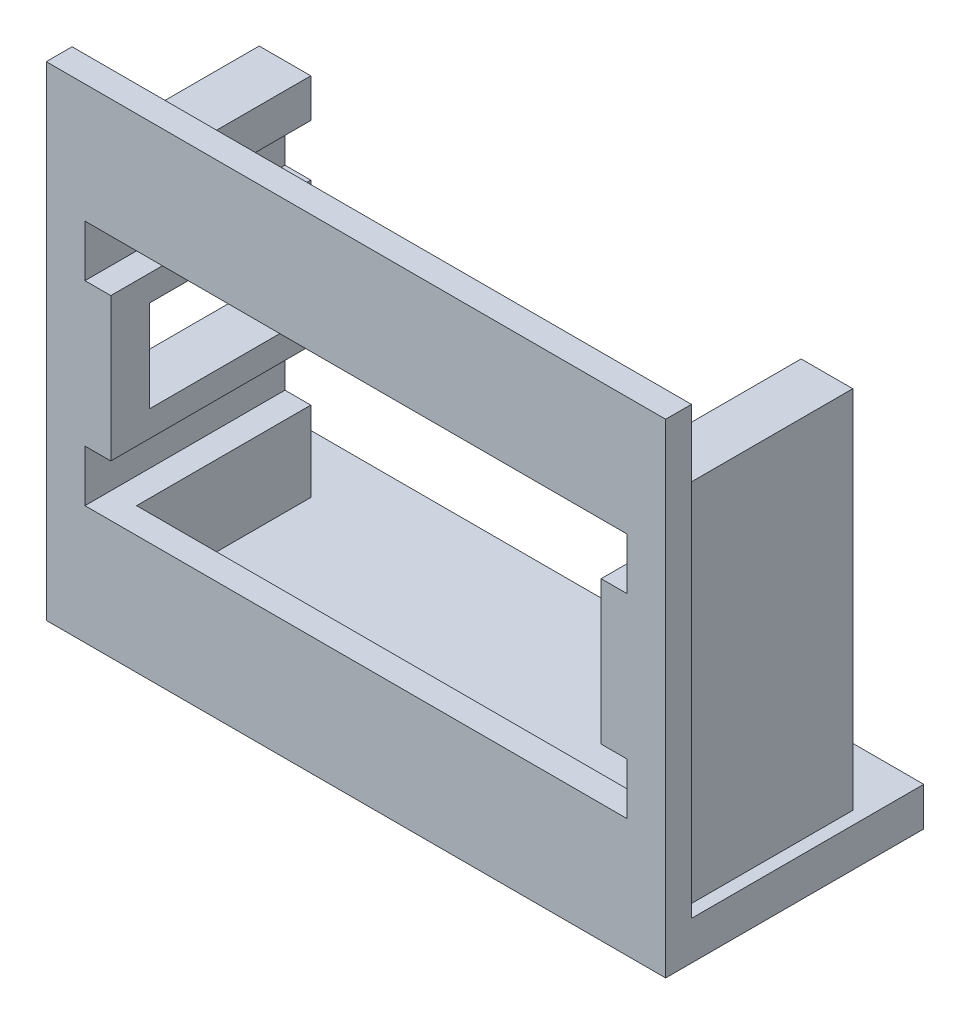
ISO-10303-21;
HEADER;
FILE_DESCRIPTION(('STEP AP214'),'2;1');
FILE_NAME('part.step','',(''),(''),'','','');
FILE_SCHEMA(('AUTOMOTIVE_DESIGN { 1 0 10303 214 1 1 1 1 }'));
ENDSEC;
DATA;
#1=APPLICATION_CONTEXT('core data for automotive mechanical design processes');
#2=APPLICATION_PROTOCOL_DEFINITION('international standard','automotive_design',2000,#1);
#3=PRODUCT_CONTEXT('',#1,'mechanical');
#4=PRODUCT('Part','Part','',(#3));
#5=PRODUCT_RELATED_PRODUCT_CATEGORY('part','',(#4));
#6=PRODUCT_DEFINITION_FORMATION('','',#4);
#7=PRODUCT_DEFINITION_CONTEXT('part definition',#1,'design');
#8=PRODUCT_DEFINITION('design','',#6,#7);
#9=PRODUCT_DEFINITION_SHAPE('','',#8);
#10=(LENGTH_UNIT() NAMED_UNIT(*) SI_UNIT(.MILLI.,.METRE.));
#11=(NAMED_UNIT(*) PLANE_ANGLE_UNIT() SI_UNIT($,.RADIAN.));
#12=(NAMED_UNIT(*) SI_UNIT($,.STERADIAN.) SOLID_ANGLE_UNIT());
#13=UNCERTAINTY_MEASURE_WITH_UNIT(LENGTH_MEASURE(1.E-05),#10,'distance_accuracy_value','');
#14=(GEOMETRIC_REPRESENTATION_CONTEXT(3) GLOBAL_UNCERTAINTY_ASSIGNED_CONTEXT((#13)) GLOBAL_UNIT_ASSIGNED_CONTEXT((#10,
#11,#12)) REPRESENTATION_CONTEXT('',''));
#15=CARTESIAN_POINT('',(0.,0.,0.));
#16=DIRECTION('',(0.,0.,1.));
#17=DIRECTION('',(1.,0.,0.));
#18=AXIS2_PLACEMENT_3D('',#15,#16,#17);
#19=CARTESIAN_POINT('',(36.,11.99,55.));
#20=DIRECTION('',(0.,0.,-1.));
#21=DIRECTION('',(-1.,0.,0.));
#22=AXIS2_PLACEMENT_3D('',#19,#20,#21);
#23=PLANE('',#22);
#24=DIRECTION('',(1.,0.,0.));
#25=VECTOR('',#24,1.);
#26=CARTESIAN_POINT('',(36.,12.,55.));
#27=LINE('',#26,#25);
#28=CARTESIAN_POINT('',(36.,12.,55.));
#29=VERTEX_POINT('',#28);
#30=CARTESIAN_POINT('',(84.,12.,55.));
#31=VERTEX_POINT('',#30);
#32=EDGE_CURVE('E610',#29,#31,#27,.T.);
#33=ORIENTED_EDGE('',*,*,#32,.F.);
#34=DIRECTION('',(0.,-1.,0.));
#35=VECTOR('',#34,1.);
#36=CARTESIAN_POINT('',(36.,49.5,55.));
#37=LINE('',#36,#35);
#38=CARTESIAN_POINT('',(36.,15.,55.));
#39=VERTEX_POINT('',#38);
#40=EDGE_CURVE('E628',#39,#29,#37,.T.);
#41=ORIENTED_EDGE('',*,*,#40,.F.);
#42=DIRECTION('',(-1.,0.,0.));
#43=VECTOR('',#42,1.);
#44=CARTESIAN_POINT('',(0.,15.,55.));
#45=LINE('',#44,#43);
#46=CARTESIAN_POINT('',(84.,15.,55.));
#47=VERTEX_POINT('',#46);
#48=EDGE_CURVE('E620',#47,#39,#45,.T.);
#49=ORIENTED_EDGE('',*,*,#48,.F.);
#50=DIRECTION('',(0.,1.,0.));
#51=VECTOR('',#50,1.);
#52=CARTESIAN_POINT('',(84.,49.5,55.));
#53=LINE('',#52,#51);
#54=EDGE_CURVE('E621',#31,#47,#53,.T.);
#55=ORIENTED_EDGE('',*,*,#54,.F.);
#56=EDGE_LOOP('',(#33,#41,#49,#55));
#57=FACE_BOUND('',#56,.T.);
#58=ADVANCED_FACE('F385',(#57),#23,.T.);
#59=CARTESIAN_POINT('',(84.,49.5,-75.01));
#60=DIRECTION('',(1.,0.,0.));
#61=DIRECTION('',(0.,0.,-1.));
#62=AXIS2_PLACEMENT_3D('',#59,#60,#61);
#63=PLANE('',#62);
#64=DIRECTION('',(0.,0.,1.));
#65=VECTOR('',#64,1.);
#66=CARTESIAN_POINT('',(84.,12.,-75.01));
#67=LINE('',#66,#65);
#68=CARTESIAN_POINT('',(84.,12.,75.));
#69=VERTEX_POINT('',#68);
#70=EDGE_CURVE('E613',#31,#69,#67,.T.);
#71=ORIENTED_EDGE('',*,*,#70,.F.);
#72=ORIENTED_EDGE('',*,*,#54,.T.);
#73=DIRECTION('',(0.,0.,-1.));
#74=VECTOR('',#73,1.);
#75=CARTESIAN_POINT('',(84.,15.,0.));
#76=LINE('',#75,#74);
#77=CARTESIAN_POINT('',(84.,15.,73.));
#78=VERTEX_POINT('',#77);
#79=EDGE_CURVE('E389',#78,#47,#76,.T.);
#80=ORIENTED_EDGE('',*,*,#79,.F.);
#81=DIRECTION('',(0.,-1.,0.));
#82=VECTOR('',#81,1.);
#83=CARTESIAN_POINT('',(84.,80.,73.));
#84=LINE('',#83,#82);
#85=CARTESIAN_POINT('',(84.,49.5,73.));
#86=VERTEX_POINT('',#85);
#87=EDGE_CURVE('E646',#86,#78,#84,.T.);
#88=ORIENTED_EDGE('',*,*,#87,.F.);
#89=DIRECTION('',(0.,0.,1.));
#90=VECTOR('',#89,1.);
#91=CARTESIAN_POINT('',(84.,49.5,-75.01));
#92=LINE('',#91,#90);
#93=CARTESIAN_POINT('',(84.,49.5,75.));
#94=VERTEX_POINT('',#93);
#95=EDGE_CURVE('E403',#86,#94,#92,.T.);
#96=ORIENTED_EDGE('',*,*,#95,.T.);
#97=DIRECTION('',(0.,-1.,0.));
#98=VECTOR('',#97,1.);
#99=CARTESIAN_POINT('',(84.,80.,75.));
#100=LINE('',#99,#98);
#101=EDGE_CURVE('E633',#94,#69,#100,.T.);
#102=ORIENTED_EDGE('',*,*,#101,.T.);
#103=EDGE_LOOP('',(#71,#72,#80,#88,#96,#102));
#104=FACE_BOUND('',#103,.T.);
#105=ADVANCED_FACE('F631',(#104),#63,.T.);
#106=CARTESIAN_POINT('',(53.6751725826515,34.3,72.));
#107=DIRECTION('',(0.,1.,0.));
#108=DIRECTION('',(-1.,0.,0.));
#109=AXIS2_PLACEMENT_3D('',#106,#107,#108);
#110=PLANE('',#109);
#111=DIRECTION('',(0.,0.,1.));
#112=VECTOR('',#111,1.);
#113=CARTESIAN_POINT('',(41.,34.3,72.));
#114=LINE('',#113,#112);
#115=CARTESIAN_POINT('',(41.,34.3,61.5));
#116=VERTEX_POINT('',#115);
#117=CARTESIAN_POINT('',(41.,34.3,72.));
#118=VERTEX_POINT('',#117);
#119=EDGE_CURVE('E665',#116,#118,#114,.T.);
#120=ORIENTED_EDGE('',*,*,#119,.T.);
#121=DIRECTION('',(-1.,0.,0.));
#122=VECTOR('',#121,1.);
#123=CARTESIAN_POINT('',(53.6751725826515,34.3,72.));
#124=LINE('',#123,#122);
#125=CARTESIAN_POINT('',(37.,34.3,72.));
#126=VERTEX_POINT('',#125);
#127=EDGE_CURVE('E697',#118,#126,#124,.T.);
#128=ORIENTED_EDGE('',*,*,#127,.T.);
#129=DIRECTION('',(0.,0.,-1.));
#130=VECTOR('',#129,1.);
#131=CARTESIAN_POINT('',(37.,34.3,72.));
#132=LINE('',#131,#130);
#133=CARTESIAN_POINT('',(37.,34.3,61.5));
#134=VERTEX_POINT('',#133);
#135=EDGE_CURVE('E683',#126,#134,#132,.T.);
#136=ORIENTED_EDGE('',*,*,#135,.T.);
#137=DIRECTION('',(-1.,0.,0.));
#138=VECTOR('',#137,1.);
#139=CARTESIAN_POINT('',(53.6751725826515,34.3,61.5));
#140=LINE('',#139,#138);
#141=EDGE_CURVE('E694',#116,#134,#140,.T.);
#142=ORIENTED_EDGE('',*,*,#141,.F.);
#143=EDGE_LOOP('',(#120,#128,#136,#142));
#144=FACE_BOUND('',#143,.T.);
#145=ADVANCED_FACE('F1068',(#144),#110,.F.);
#146=CARTESIAN_POINT('',(53.6751725826515,27.2,72.));
#147=DIRECTION('',(0.,0.,1.));
#148=DIRECTION('',(1.,0.,0.));
#149=AXIS2_PLACEMENT_3D('',#146,#147,#148);
#150=PLANE('',#149);
#151=DIRECTION('',(0.,-1.,0.));
#152=VECTOR('',#151,1.);
#153=CARTESIAN_POINT('',(41.,27.2,72.));
#154=LINE('',#153,#152);
#155=CARTESIAN_POINT('',(41.,27.2,72.));
#156=VERTEX_POINT('',#155);
#157=EDGE_CURVE('E676',#118,#156,#154,.T.);
#158=ORIENTED_EDGE('',*,*,#157,.T.);
#159=DIRECTION('',(-1.,0.,0.));
#160=VECTOR('',#159,1.);
#161=CARTESIAN_POINT('',(53.6751725826515,27.2,72.));
#162=LINE('',#161,#160);
#163=CARTESIAN_POINT('',(37.,27.2,72.));
#164=VERTEX_POINT('',#163);
#165=EDGE_CURVE('E691',#156,#164,#162,.T.);
#166=ORIENTED_EDGE('',*,*,#165,.T.);
#167=DIRECTION('',(0.,1.,0.));
#168=VECTOR('',#167,1.);
#169=CARTESIAN_POINT('',(37.,27.2,72.));
#170=LINE('',#169,#168);
#171=EDGE_CURVE('E679',#164,#126,#170,.T.);
#172=ORIENTED_EDGE('',*,*,#171,.T.);
#173=ORIENTED_EDGE('',*,*,#127,.F.);
#174=EDGE_LOOP('',(#158,#166,#172,#173));
#175=FACE_BOUND('',#174,.T.);
#176=ADVANCED_FACE('F1070',(#175),#150,.F.);
#177=CARTESIAN_POINT('',(53.6751725826515,27.2,61.5));
#178=DIRECTION('',(0.,-1.,0.));
#179=DIRECTION('',(1.,0.,0.));
#180=AXIS2_PLACEMENT_3D('',#177,#178,#179);
#181=PLANE('',#180);
#182=DIRECTION('',(0.,0.,-1.));
#183=VECTOR('',#182,1.);
#184=CARTESIAN_POINT('',(41.,27.2,61.5));
#185=LINE('',#184,#183);
#186=CARTESIAN_POINT('',(41.,27.2,61.5));
#187=VERTEX_POINT('',#186);
#188=EDGE_CURVE('E673',#156,#187,#185,.T.);
#189=ORIENTED_EDGE('',*,*,#188,.T.);
#190=DIRECTION('',(-1.,0.,0.));
#191=VECTOR('',#190,1.);
#192=CARTESIAN_POINT('',(53.6751725826515,27.2,61.5));
#193=LINE('',#192,#191);
#194=CARTESIAN_POINT('',(37.,27.2,61.5));
#195=VERTEX_POINT('',#194);
#196=EDGE_CURVE('E670',#187,#195,#193,.T.);
#197=ORIENTED_EDGE('',*,*,#196,.T.);
#198=DIRECTION('',(0.,0.,1.));
#199=VECTOR('',#198,1.);
#200=CARTESIAN_POINT('',(37.,27.2,61.5));
#201=LINE('',#200,#199);
#202=EDGE_CURVE('E643',#195,#164,#201,.T.);
#203=ORIENTED_EDGE('',*,*,#202,.T.);
#204=ORIENTED_EDGE('',*,*,#165,.F.);
#205=EDGE_LOOP('',(#189,#197,#203,#204));
#206=FACE_BOUND('',#205,.T.);
#207=ADVANCED_FACE('F1077',(#206),#181,.F.);
#208=CARTESIAN_POINT('',(53.6751725826515,34.3,61.5));
#209=DIRECTION('',(0.,0.,-1.));
#210=DIRECTION('',(-1.,0.,0.));
#211=AXIS2_PLACEMENT_3D('',#208,#209,#210);
#212=PLANE('',#211);
#213=DIRECTION('',(0.,1.,0.));
#214=VECTOR('',#213,1.);
#215=CARTESIAN_POINT('',(41.,34.3,61.5));
#216=LINE('',#215,#214);
#217=EDGE_CURVE('E669',#187,#116,#216,.T.);
#218=ORIENTED_EDGE('',*,*,#217,.T.);
#219=ORIENTED_EDGE('',*,*,#141,.T.);
#220=DIRECTION('',(0.,-1.,0.));
#221=VECTOR('',#220,1.);
#222=CARTESIAN_POINT('',(37.,34.3,61.5));
#223=LINE('',#222,#221);
#224=EDGE_CURVE('E687',#134,#195,#223,.T.);
#225=ORIENTED_EDGE('',*,*,#224,.T.);
#226=ORIENTED_EDGE('',*,*,#196,.F.);
#227=EDGE_LOOP('',(#218,#219,#225,#226));
#228=FACE_BOUND('',#227,.T.);
#229=ADVANCED_FACE('F1083',(#228),#212,.F.);
#230=CARTESIAN_POINT('',(39.,36.3,30.4698930168287));
#231=DIRECTION('',(0.,-1.,0.));
#232=DIRECTION('',(0.,0.,-1.));
#233=AXIS2_PLACEMENT_3D('',#230,#231,#232);
#234=PLANE('',#233);
#235=DIRECTION('',(0.,0.,1.));
#236=VECTOR('',#235,1.);
#237=CARTESIAN_POINT('',(39.,36.3,30.4698930168287));
#238=LINE('',#237,#236);
#239=CARTESIAN_POINT('',(39.,36.3,59.5));
#240=VERTEX_POINT('',#239);
#241=CARTESIAN_POINT('',(39.,36.3,75.));
#242=VERTEX_POINT('',#241);
#243=EDGE_CURVE('E902',#240,#242,#238,.T.);
#244=ORIENTED_EDGE('',*,*,#243,.T.);
#245=DIRECTION('',(1.,0.,0.));
#246=VECTOR('',#245,1.);
#247=CARTESIAN_POINT('',(39.,36.3,75.));
#248=LINE('',#247,#246);
#249=CARTESIAN_POINT('',(41.,36.3,75.));
#250=VERTEX_POINT('',#249);
#251=EDGE_CURVE('E898',#242,#250,#248,.T.);
#252=ORIENTED_EDGE('',*,*,#251,.T.);
#253=DIRECTION('',(0.,0.,1.));
#254=VECTOR('',#253,1.);
#255=CARTESIAN_POINT('',(41.,36.3,30.4698930168287));
#256=LINE('',#255,#254);
#257=CARTESIAN_POINT('',(41.,36.3,59.5));
#258=VERTEX_POINT('',#257);
#259=EDGE_CURVE('E908',#258,#250,#256,.T.);
#260=ORIENTED_EDGE('',*,*,#259,.F.);
#261=DIRECTION('',(1.,0.,0.));
#262=VECTOR('',#261,1.);
#263=CARTESIAN_POINT('',(41.,36.3,59.5));
#264=LINE('',#263,#262);
#265=EDGE_CURVE('E859',#240,#258,#264,.T.);
#266=ORIENTED_EDGE('',*,*,#265,.F.);
#267=EDGE_LOOP('',(#244,#252,#260,#266));
#268=FACE_BOUND('',#267,.T.);
#269=ADVANCED_FACE('F1118',(#268),#234,.F.);
#270=CARTESIAN_POINT('',(39.,40.3,30.4698930168287));
#271=DIRECTION('',(-1.,0.,0.));
#272=DIRECTION('',(0.,0.,1.));
#273=AXIS2_PLACEMENT_3D('',#270,#271,#272);
#274=PLANE('',#273);
#275=DIRECTION('',(0.,0.,1.));
#276=VECTOR('',#275,1.);
#277=CARTESIAN_POINT('',(39.,40.3,30.4698930168287));
#278=LINE('',#277,#276);
#279=CARTESIAN_POINT('',(39.,40.3,59.5));
#280=VERTEX_POINT('',#279);
#281=CARTESIAN_POINT('',(39.,40.3,75.));
#282=VERTEX_POINT('',#281);
#283=EDGE_CURVE('E897',#280,#282,#278,.T.);
#284=ORIENTED_EDGE('',*,*,#283,.T.);
#285=DIRECTION('',(0.,-1.,0.));
#286=VECTOR('',#285,1.);
#287=CARTESIAN_POINT('',(39.,40.3,75.));
#288=LINE('',#287,#286);
#289=EDGE_CURVE('E903',#282,#242,#288,.T.);
#290=ORIENTED_EDGE('',*,*,#289,.T.);
#291=ORIENTED_EDGE('',*,*,#243,.F.);
#292=DIRECTION('',(0.,-1.,0.));
#293=VECTOR('',#292,1.);
#294=CARTESIAN_POINT('',(39.,36.3,59.5));
#295=LINE('',#294,#293);
#296=EDGE_CURVE('E863',#280,#240,#295,.T.);
#297=ORIENTED_EDGE('',*,*,#296,.F.);
#298=EDGE_LOOP('',(#284,#290,#291,#297));
#299=FACE_BOUND('',#298,.T.);
#300=ADVANCED_FACE('F1010',(#299),#274,.F.);
#301=CARTESIAN_POINT('',(81.,40.3,30.4698930168287));
#302=DIRECTION('',(-1.,0.,0.));
#303=DIRECTION('',(0.,0.,1.));
#304=AXIS2_PLACEMENT_3D('',#301,#302,#303);
#305=PLANE('',#304);
#306=DIRECTION('',(0.,0.,1.));
#307=VECTOR('',#306,1.);
#308=CARTESIAN_POINT('',(81.,40.3,30.4698930168287));
#309=LINE('',#308,#307);
#310=CARTESIAN_POINT('',(81.,40.3,59.5));
#311=VERTEX_POINT('',#310);
#312=CARTESIAN_POINT('',(81.,40.3,75.));
#313=VERTEX_POINT('',#312);
#314=EDGE_CURVE('E956',#311,#313,#309,.T.);
#315=ORIENTED_EDGE('',*,*,#314,.F.);
#316=DIRECTION('',(0.,1.,0.));
#317=VECTOR('',#316,1.);
#318=CARTESIAN_POINT('',(81.,40.3,59.5));
#319=LINE('',#318,#317);
#320=CARTESIAN_POINT('',(81.,36.3,59.5));
#321=VERTEX_POINT('',#320);
#322=EDGE_CURVE('E745',#321,#311,#319,.T.);
#323=ORIENTED_EDGE('',*,*,#322,.F.);
#324=DIRECTION('',(0.,0.,1.));
#325=VECTOR('',#324,1.);
#326=CARTESIAN_POINT('',(81.,36.3,30.4698930168287));
#327=LINE('',#326,#325);
#328=CARTESIAN_POINT('',(81.,36.3,75.));
#329=VERTEX_POINT('',#328);
#330=EDGE_CURVE('E791',#321,#329,#327,.T.);
#331=ORIENTED_EDGE('',*,*,#330,.T.);
#332=DIRECTION('',(0.,-1.,0.));
#333=VECTOR('',#332,1.);
#334=CARTESIAN_POINT('',(81.,40.3,75.));
#335=LINE('',#334,#333);
#336=EDGE_CURVE('E941',#313,#329,#335,.T.);
#337=ORIENTED_EDGE('',*,*,#336,.F.);
#338=EDGE_LOOP('',(#315,#323,#331,#337));
#339=FACE_BOUND('',#338,.T.);
#340=ADVANCED_FACE('F1001',(#339),#305,.T.);
#341=CARTESIAN_POINT('',(81.,36.3,30.4698930168287));
#342=DIRECTION('',(0.,1.,0.));
#343=DIRECTION('',(0.,0.,1.));
#344=AXIS2_PLACEMENT_3D('',#341,#342,#343);
#345=PLANE('',#344);
#346=ORIENTED_EDGE('',*,*,#330,.F.);
#347=DIRECTION('',(1.,0.,0.));
#348=VECTOR('',#347,1.);
#349=CARTESIAN_POINT('',(81.,36.3,59.5));
#350=LINE('',#349,#348);
#351=CARTESIAN_POINT('',(79.,36.3,59.5));
#352=VERTEX_POINT('',#351);
#353=EDGE_CURVE('E741',#352,#321,#350,.T.);
#354=ORIENTED_EDGE('',*,*,#353,.F.);
#355=DIRECTION('',(0.,0.,1.));
#356=VECTOR('',#355,1.);
#357=CARTESIAN_POINT('',(79.,36.3,30.4698930168287));
#358=LINE('',#357,#356);
#359=CARTESIAN_POINT('',(79.,36.3,75.));
#360=VERTEX_POINT('',#359);
#361=EDGE_CURVE('E911',#352,#360,#358,.T.);
#362=ORIENTED_EDGE('',*,*,#361,.T.);
#363=DIRECTION('',(-1.,0.,0.));
#364=VECTOR('',#363,1.);
#365=CARTESIAN_POINT('',(81.,36.3,75.));
#366=LINE('',#365,#364);
#367=EDGE_CURVE('E952',#329,#360,#366,.T.);
#368=ORIENTED_EDGE('',*,*,#367,.F.);
#369=EDGE_LOOP('',(#346,#354,#362,#368));
#370=FACE_BOUND('',#369,.T.);
#371=ADVANCED_FACE('F1058',(#370),#345,.T.);
#372=CARTESIAN_POINT('',(79.,40.3,30.4698930168287));
#373=DIRECTION('',(-1.,0.,0.));
#374=DIRECTION('',(0.,0.,1.));
#375=AXIS2_PLACEMENT_3D('',#372,#373,#374);
#376=PLANE('',#375);
#377=DIRECTION('',(0.,0.,1.));
#378=VECTOR('',#377,1.);
#379=CARTESIAN_POINT('',(79.,25.2,30.4698930168287));
#380=LINE('',#379,#378);
#381=CARTESIAN_POINT('',(79.,25.2,59.5));
#382=VERTEX_POINT('',#381);
#383=CARTESIAN_POINT('',(79.,25.2,75.));
#384=VERTEX_POINT('',#383);
#385=EDGE_CURVE('E942',#382,#384,#380,.T.);
#386=ORIENTED_EDGE('',*,*,#385,.T.);
#387=DIRECTION('',(0.,-1.,0.));
#388=VECTOR('',#387,1.);
#389=CARTESIAN_POINT('',(79.,40.3,75.));
#390=LINE('',#389,#388);
#391=EDGE_CURVE('E879',#360,#384,#390,.T.);
#392=ORIENTED_EDGE('',*,*,#391,.F.);
#393=ORIENTED_EDGE('',*,*,#361,.F.);
#394=DIRECTION('',(0.,1.,0.));
#395=VECTOR('',#394,1.);
#396=CARTESIAN_POINT('',(79.,36.3,59.5));
#397=LINE('',#396,#395);
#398=EDGE_CURVE('E737',#382,#352,#397,.T.);
#399=ORIENTED_EDGE('',*,*,#398,.F.);
#400=EDGE_LOOP('',(#386,#392,#393,#399));
#401=FACE_BOUND('',#400,.T.);
#402=ADVANCED_FACE('F1054',(#401),#376,.T.);
#403=CARTESIAN_POINT('',(81.,25.2,30.4698930168287));
#404=DIRECTION('',(0.,1.,0.));
#405=DIRECTION('',(0.,0.,1.));
#406=AXIS2_PLACEMENT_3D('',#403,#404,#405);
#407=PLANE('',#406);
#408=DIRECTION('',(0.,0.,1.));
#409=VECTOR('',#408,1.);
#410=CARTESIAN_POINT('',(81.,25.2,30.4698930168287));
#411=LINE('',#410,#409);
#412=CARTESIAN_POINT('',(81.,25.2,59.5));
#413=VERTEX_POINT('',#412);
#414=CARTESIAN_POINT('',(81.,25.2,75.));
#415=VERTEX_POINT('',#414);
#416=EDGE_CURVE('E937',#413,#415,#411,.T.);
#417=ORIENTED_EDGE('',*,*,#416,.T.);
#418=DIRECTION('',(-1.,0.,0.));
#419=VECTOR('',#418,1.);
#420=CARTESIAN_POINT('',(81.,25.2,75.));
#421=LINE('',#420,#419);
#422=EDGE_CURVE('E933',#415,#384,#421,.T.);
#423=ORIENTED_EDGE('',*,*,#422,.T.);
#424=ORIENTED_EDGE('',*,*,#385,.F.);
#425=DIRECTION('',(-1.,0.,0.));
#426=VECTOR('',#425,1.);
#427=CARTESIAN_POINT('',(79.,25.2,59.5));
#428=LINE('',#427,#426);
#429=EDGE_CURVE('E733',#413,#382,#428,.T.);
#430=ORIENTED_EDGE('',*,*,#429,.F.);
#431=EDGE_LOOP('',(#417,#423,#424,#430));
#432=FACE_BOUND('',#431,.T.);
#433=ADVANCED_FACE('F1050',(#432),#407,.F.);
#434=CARTESIAN_POINT('',(81.,21.2,30.4698930168287));
#435=DIRECTION('',(1.,0.,0.));
#436=DIRECTION('',(0.,0.,-1.));
#437=AXIS2_PLACEMENT_3D('',#434,#435,#436);
#438=PLANE('',#437);
#439=DIRECTION('',(0.,0.,1.));
#440=VECTOR('',#439,1.);
#441=CARTESIAN_POINT('',(81.,21.2,30.4698930168287));
#442=LINE('',#441,#440);
#443=CARTESIAN_POINT('',(81.,21.2,59.5));
#444=VERTEX_POINT('',#443);
#445=CARTESIAN_POINT('',(81.,21.2,75.));
#446=VERTEX_POINT('',#445);
#447=EDGE_CURVE('E930',#444,#446,#442,.T.);
#448=ORIENTED_EDGE('',*,*,#447,.T.);
#449=DIRECTION('',(0.,1.,0.));
#450=VECTOR('',#449,1.);
#451=CARTESIAN_POINT('',(81.,21.2,75.));
#452=LINE('',#451,#450);
#453=EDGE_CURVE('E938',#446,#415,#452,.T.);
#454=ORIENTED_EDGE('',*,*,#453,.T.);
#455=ORIENTED_EDGE('',*,*,#416,.F.);
#456=DIRECTION('',(0.,1.,0.));
#457=VECTOR('',#456,1.);
#458=CARTESIAN_POINT('',(81.,25.2,59.5));
#459=LINE('',#458,#457);
#460=EDGE_CURVE('E729',#444,#413,#459,.T.);
#461=ORIENTED_EDGE('',*,*,#460,.F.);
#462=EDGE_LOOP('',(#448,#454,#455,#461));
#463=FACE_BOUND('',#462,.T.);
#464=ADVANCED_FACE('F1046',(#463),#438,.F.);
#465=CARTESIAN_POINT('',(41.,21.2,30.4698930168287));
#466=DIRECTION('',(0.,-1.,0.));
#467=DIRECTION('',(1.,0.,0.));
#468=AXIS2_PLACEMENT_3D('',#465,#466,#467);
#469=PLANE('',#468);
#470=DIRECTION('',(1.,0.,0.));
#471=VECTOR('',#470,1.);
#472=CARTESIAN_POINT('',(41.,21.2,75.));
#473=LINE('',#472,#471);
#474=CARTESIAN_POINT('',(39.,21.2,75.));
#475=VERTEX_POINT('',#474);
#476=EDGE_CURVE('E884',#475,#446,#473,.T.);
#477=ORIENTED_EDGE('',*,*,#476,.T.);
#478=ORIENTED_EDGE('',*,*,#447,.F.);
#479=DIRECTION('',(1.,0.,0.));
#480=VECTOR('',#479,1.);
#481=CARTESIAN_POINT('',(81.,21.2,59.5));
#482=LINE('',#481,#480);
#483=CARTESIAN_POINT('',(79.,21.2,59.5));
#484=VERTEX_POINT('',#483);
#485=EDGE_CURVE('E725',#484,#444,#482,.T.);
#486=ORIENTED_EDGE('',*,*,#485,.F.);
#487=DIRECTION('',(0.,0.,1.));
#488=VECTOR('',#487,1.);
#489=CARTESIAN_POINT('',(79.,21.2,59.5));
#490=LINE('',#489,#488);
#491=CARTESIAN_POINT('',(79.,21.2,73.));
#492=VERTEX_POINT('',#491);
#493=EDGE_CURVE('E772',#484,#492,#490,.T.);
#494=ORIENTED_EDGE('',*,*,#493,.T.);
#495=DIRECTION('',(1.,0.,0.));
#496=VECTOR('',#495,1.);
#497=CARTESIAN_POINT('',(41.,21.2,73.));
#498=LINE('',#497,#496);
#499=CARTESIAN_POINT('',(41.,21.2,73.));
#500=VERTEX_POINT('',#499);
#501=EDGE_CURVE('E883',#500,#492,#498,.T.);
#502=ORIENTED_EDGE('',*,*,#501,.F.);
#503=DIRECTION('',(0.,0.,1.));
#504=VECTOR('',#503,1.);
#505=CARTESIAN_POINT('',(41.,21.2,59.5));
#506=LINE('',#505,#504);
#507=CARTESIAN_POINT('',(41.,21.2,59.5));
#508=VERTEX_POINT('',#507);
#509=EDGE_CURVE('E795',#508,#500,#506,.T.);
#510=ORIENTED_EDGE('',*,*,#509,.F.);
#511=DIRECTION('',(1.,0.,0.));
#512=VECTOR('',#511,1.);
#513=CARTESIAN_POINT('',(41.,21.2,59.5));
#514=LINE('',#513,#512);
#515=CARTESIAN_POINT('',(39.,21.2,59.5));
#516=VERTEX_POINT('',#515);
#517=EDGE_CURVE('E844',#516,#508,#514,.T.);
#518=ORIENTED_EDGE('',*,*,#517,.F.);
#519=DIRECTION('',(0.,0.,1.));
#520=VECTOR('',#519,1.);
#521=CARTESIAN_POINT('',(39.,21.2,30.4698930168287));
#522=LINE('',#521,#520);
#523=EDGE_CURVE('E921',#516,#475,#522,.T.);
#524=ORIENTED_EDGE('',*,*,#523,.T.);
#525=EDGE_LOOP('',(#477,#478,#486,#494,#502,#510,#518,#524));
#526=FACE_BOUND('',#525,.T.);
#527=ADVANCED_FACE('F1042',(#526),#469,.F.);
#528=CARTESIAN_POINT('',(41.,40.3,30.4698930168287));
#529=DIRECTION('',(-1.,0.,0.));
#530=DIRECTION('',(0.,0.,1.));
#531=AXIS2_PLACEMENT_3D('',#528,#529,#530);
#532=PLANE('',#531);
#533=ORIENTED_EDGE('',*,*,#217,.F.);
#534=ORIENTED_EDGE('',*,*,#188,.F.);
#535=ORIENTED_EDGE('',*,*,#157,.F.);
#536=ORIENTED_EDGE('',*,*,#119,.F.);
#537=EDGE_LOOP('',(#533,#534,#535,#536));
#538=FACE_BOUND('',#537,.T.);
#539=ORIENTED_EDGE('',*,*,#259,.T.);
#540=DIRECTION('',(0.,-1.,0.));
#541=VECTOR('',#540,1.);
#542=CARTESIAN_POINT('',(41.,40.3,75.));
#543=LINE('',#542,#541);
#544=CARTESIAN_POINT('',(41.,25.2,75.));
#545=VERTEX_POINT('',#544);
#546=EDGE_CURVE('E887',#250,#545,#543,.T.);
#547=ORIENTED_EDGE('',*,*,#546,.T.);
#548=DIRECTION('',(0.,0.,1.));
#549=VECTOR('',#548,1.);
#550=CARTESIAN_POINT('',(41.,25.2,30.4698930168287));
#551=LINE('',#550,#549);
#552=CARTESIAN_POINT('',(41.,25.2,59.5));
#553=VERTEX_POINT('',#552);
#554=EDGE_CURVE('E878',#553,#545,#551,.T.);
#555=ORIENTED_EDGE('',*,*,#554,.F.);
#556=DIRECTION('',(0.,-1.,0.));
#557=VECTOR('',#556,1.);
#558=CARTESIAN_POINT('',(41.,36.3,59.5));
#559=LINE('',#558,#557);
#560=EDGE_CURVE('E855',#258,#553,#559,.T.);
#561=ORIENTED_EDGE('',*,*,#560,.F.);
#562=EDGE_LOOP('',(#539,#547,#555,#561));
#563=FACE_BOUND('',#562,.T.);
#564=ADVANCED_FACE('F1091',(#538,#563),#532,.F.);
#565=CARTESIAN_POINT('',(0.,0.,59.5));
#566=DIRECTION('',(0.,0.,1.));
#567=DIRECTION('',(1.,0.,0.));
#568=AXIS2_PLACEMENT_3D('',#565,#566,#567);
#569=PLANE('',#568);
#570=DIRECTION('',(0.,1.,0.));
#571=VECTOR('',#570,1.);
#572=CARTESIAN_POINT('',(79.,43.3,59.5));
#573=LINE('',#572,#571);
#574=CARTESIAN_POINT('',(79.,40.3,59.5));
#575=VERTEX_POINT('',#574);
#576=CARTESIAN_POINT('',(79.,43.3,59.5));
#577=VERTEX_POINT('',#576);
#578=EDGE_CURVE('E706',#575,#577,#573,.T.);
#579=ORIENTED_EDGE('',*,*,#578,.T.);
#580=DIRECTION('',(1.,0.,0.));
#581=VECTOR('',#580,1.);
#582=CARTESIAN_POINT('',(79.,43.3,59.5));
#583=LINE('',#582,#581);
#584=CARTESIAN_POINT('',(83.,43.3,59.5));
#585=VERTEX_POINT('',#584);
#586=EDGE_CURVE('E710',#577,#585,#583,.T.);
#587=ORIENTED_EDGE('',*,*,#586,.T.);
#588=DIRECTION('',(0.,-1.,0.));
#589=VECTOR('',#588,1.);
#590=CARTESIAN_POINT('',(83.,43.3,59.5));
#591=LINE('',#590,#589);
#592=CARTESIAN_POINT('',(83.,15.,59.5));
#593=VERTEX_POINT('',#592);
#594=EDGE_CURVE('E714',#585,#593,#591,.T.);
#595=ORIENTED_EDGE('',*,*,#594,.T.);
#596=DIRECTION('',(-1.,0.,0.));
#597=VECTOR('',#596,1.);
#598=CARTESIAN_POINT('',(79.,15.,59.5));
#599=LINE('',#598,#597);
#600=CARTESIAN_POINT('',(79.,15.,59.5));
#601=VERTEX_POINT('',#600);
#602=EDGE_CURVE('E718',#593,#601,#599,.T.);
#603=ORIENTED_EDGE('',*,*,#602,.T.);
#604=DIRECTION('',(0.,1.,0.));
#605=VECTOR('',#604,1.);
#606=CARTESIAN_POINT('',(79.,21.2,59.5));
#607=LINE('',#606,#605);
#608=EDGE_CURVE('E722',#601,#484,#607,.T.);
#609=ORIENTED_EDGE('',*,*,#608,.T.);
#610=ORIENTED_EDGE('',*,*,#485,.T.);
#611=ORIENTED_EDGE('',*,*,#460,.T.);
#612=ORIENTED_EDGE('',*,*,#429,.T.);
#613=ORIENTED_EDGE('',*,*,#398,.T.);
#614=ORIENTED_EDGE('',*,*,#353,.T.);
#615=ORIENTED_EDGE('',*,*,#322,.T.);
#616=DIRECTION('',(-1.,0.,0.));
#617=VECTOR('',#616,1.);
#618=CARTESIAN_POINT('',(79.,40.3,59.5));
#619=LINE('',#618,#617);
#620=EDGE_CURVE('E749',#311,#575,#619,.T.);
#621=ORIENTED_EDGE('',*,*,#620,.T.);
#622=EDGE_LOOP('',(#579,#587,#595,#603,#609,#610,#611,#612,#613,#614,#615,#621));
#623=FACE_BOUND('',#622,.T.);
#624=ADVANCED_FACE('F997',(#623),#569,.F.);
#625=CARTESIAN_POINT('',(79.,21.2,59.5));
#626=DIRECTION('',(1.,0.,0.));
#627=DIRECTION('',(0.,1.,0.));
#628=AXIS2_PLACEMENT_3D('',#625,#626,#627);
#629=PLANE('',#628);
#630=DIRECTION('',(0.,1.,0.));
#631=VECTOR('',#630,1.);
#632=CARTESIAN_POINT('',(79.,21.2,73.));
#633=LINE('',#632,#631);
#634=CARTESIAN_POINT('',(79.,15.,73.));
#635=VERTEX_POINT('',#634);
#636=EDGE_CURVE('E711',#635,#492,#633,.T.);
#637=ORIENTED_EDGE('',*,*,#636,.T.);
#638=ORIENTED_EDGE('',*,*,#493,.F.);
#639=ORIENTED_EDGE('',*,*,#608,.F.);
#640=DIRECTION('',(0.,0.,1.));
#641=VECTOR('',#640,1.);
#642=CARTESIAN_POINT('',(79.,15.,59.5));
#643=LINE('',#642,#641);
#644=EDGE_CURVE('E776',#601,#635,#643,.T.);
#645=ORIENTED_EDGE('',*,*,#644,.T.);
#646=EDGE_LOOP('',(#637,#638,#639,#645));
#647=FACE_BOUND('',#646,.T.);
#648=ADVANCED_FACE('F1038',(#647),#629,.F.);
#649=CARTESIAN_POINT('',(-100.,80.,73.));
#650=DIRECTION('',(0.,0.,-1.));
#651=DIRECTION('',(-1.,0.,0.));
#652=AXIS2_PLACEMENT_3D('',#649,#650,#651);
#653=PLANE('',#652);
#654=ORIENTED_EDGE('',*,*,#501,.T.);
#655=ORIENTED_EDGE('',*,*,#636,.F.);
#656=DIRECTION('',(1.,0.,0.));
#657=VECTOR('',#656,1.);
#658=CARTESIAN_POINT('',(-100.,15.,73.));
#659=LINE('',#658,#657);
#660=CARTESIAN_POINT('',(41.,15.,73.));
#661=VERTEX_POINT('',#660);
#662=EDGE_CURVE('E973',#661,#635,#659,.T.);
#663=ORIENTED_EDGE('',*,*,#662,.F.);
#664=DIRECTION('',(0.,-1.,0.));
#665=VECTOR('',#664,1.);
#666=CARTESIAN_POINT('',(41.,21.2,73.));
#667=LINE('',#666,#665);
#668=EDGE_CURVE('E824',#500,#661,#667,.T.);
#669=ORIENTED_EDGE('',*,*,#668,.F.);
#670=EDGE_LOOP('',(#654,#655,#663,#669));
#671=FACE_BOUND('',#670,.T.);
#672=ADVANCED_FACE('F1034',(#671),#653,.T.);
#673=CARTESIAN_POINT('',(41.,21.2,59.5));
#674=DIRECTION('',(-1.,0.,0.));
#675=DIRECTION('',(0.,0.,1.));
#676=AXIS2_PLACEMENT_3D('',#673,#674,#675);
#677=PLANE('',#676);
#678=ORIENTED_EDGE('',*,*,#668,.T.);
#679=DIRECTION('',(0.,0.,1.));
#680=VECTOR('',#679,1.);
#681=CARTESIAN_POINT('',(41.,15.,59.5));
#682=LINE('',#681,#680);
#683=CARTESIAN_POINT('',(41.,15.,59.5));
#684=VERTEX_POINT('',#683);
#685=EDGE_CURVE('E799',#684,#661,#682,.T.);
#686=ORIENTED_EDGE('',*,*,#685,.F.);
#687=DIRECTION('',(0.,-1.,0.));
#688=VECTOR('',#687,1.);
#689=CARTESIAN_POINT('',(41.,21.2,59.5));
#690=LINE('',#689,#688);
#691=EDGE_CURVE('E840',#508,#684,#690,.T.);
#692=ORIENTED_EDGE('',*,*,#691,.F.);
#693=ORIENTED_EDGE('',*,*,#509,.T.);
#694=EDGE_LOOP('',(#678,#686,#692,#693));
#695=FACE_BOUND('',#694,.T.);
#696=ADVANCED_FACE('F1031',(#695),#677,.F.);
#697=CARTESIAN_POINT('',(0.,0.,59.5));
#698=DIRECTION('',(0.,0.,1.));
#699=DIRECTION('',(1.,0.,0.));
#700=AXIS2_PLACEMENT_3D('',#697,#698,#699);
#701=PLANE('',#700);
#702=DIRECTION('',(0.,-1.,0.));
#703=VECTOR('',#702,1.);
#704=CARTESIAN_POINT('',(41.,43.3,59.5));
#705=LINE('',#704,#703);
#706=CARTESIAN_POINT('',(41.,43.3,59.5));
#707=VERTEX_POINT('',#706);
#708=CARTESIAN_POINT('',(41.,40.3,59.5));
#709=VERTEX_POINT('',#708);
#710=EDGE_CURVE('E820',#707,#709,#705,.T.);
#711=ORIENTED_EDGE('',*,*,#710,.T.);
#712=DIRECTION('',(-1.,0.,0.));
#713=VECTOR('',#712,1.);
#714=CARTESIAN_POINT('',(39.,40.3,59.5));
#715=LINE('',#714,#713);
#716=EDGE_CURVE('E867',#709,#280,#715,.T.);
#717=ORIENTED_EDGE('',*,*,#716,.T.);
#718=ORIENTED_EDGE('',*,*,#296,.T.);
#719=ORIENTED_EDGE('',*,*,#265,.T.);
#720=ORIENTED_EDGE('',*,*,#560,.T.);
#721=DIRECTION('',(-1.,0.,0.));
#722=VECTOR('',#721,1.);
#723=CARTESIAN_POINT('',(39.,25.2,59.5));
#724=LINE('',#723,#722);
#725=CARTESIAN_POINT('',(39.,25.2,59.5));
#726=VERTEX_POINT('',#725);
#727=EDGE_CURVE('E851',#553,#726,#724,.T.);
#728=ORIENTED_EDGE('',*,*,#727,.T.);
#729=DIRECTION('',(0.,-1.,0.));
#730=VECTOR('',#729,1.);
#731=CARTESIAN_POINT('',(39.,21.2,59.5));
#732=LINE('',#731,#730);
#733=EDGE_CURVE('E847',#726,#516,#732,.T.);
#734=ORIENTED_EDGE('',*,*,#733,.T.);
#735=ORIENTED_EDGE('',*,*,#517,.T.);
#736=ORIENTED_EDGE('',*,*,#691,.T.);
#737=DIRECTION('',(-1.,0.,0.));
#738=VECTOR('',#737,1.);
#739=CARTESIAN_POINT('',(41.,15.,59.5));
#740=LINE('',#739,#738);
#741=CARTESIAN_POINT('',(37.,15.,59.5));
#742=VERTEX_POINT('',#741);
#743=EDGE_CURVE('E836',#684,#742,#740,.T.);
#744=ORIENTED_EDGE('',*,*,#743,.T.);
#745=DIRECTION('',(0.,1.,0.));
#746=VECTOR('',#745,1.);
#747=CARTESIAN_POINT('',(37.,43.3,59.5));
#748=LINE('',#747,#746);
#749=CARTESIAN_POINT('',(37.,43.3,59.5));
#750=VERTEX_POINT('',#749);
#751=EDGE_CURVE('E833',#742,#750,#748,.T.);
#752=ORIENTED_EDGE('',*,*,#751,.T.);
#753=DIRECTION('',(1.,0.,0.));
#754=VECTOR('',#753,1.);
#755=CARTESIAN_POINT('',(41.,43.3,59.5));
#756=LINE('',#755,#754);
#757=EDGE_CURVE('E814',#750,#707,#756,.T.);
#758=ORIENTED_EDGE('',*,*,#757,.T.);
#759=EDGE_LOOP('',(#711,#717,#718,#719,#720,#728,#734,#735,#736,#744,#752,#758));
#760=FACE_BOUND('',#759,.T.);
#761=ADVANCED_FACE('F1013',(#760),#701,.F.);
#762=CARTESIAN_POINT('',(37.,43.3,59.5));
#763=DIRECTION('',(1.,0.,0.));
#764=DIRECTION('',(0.,0.,-1.));
#765=AXIS2_PLACEMENT_3D('',#762,#763,#764);
#766=PLANE('',#765);
#767=ORIENTED_EDGE('',*,*,#171,.F.);
#768=ORIENTED_EDGE('',*,*,#202,.F.);
#769=ORIENTED_EDGE('',*,*,#224,.F.);
#770=ORIENTED_EDGE('',*,*,#135,.F.);
#771=EDGE_LOOP('',(#767,#768,#769,#770));
#772=FACE_BOUND('',#771,.T.);
#773=DIRECTION('',(0.,1.,0.));
#774=VECTOR('',#773,1.);
#775=CARTESIAN_POINT('',(37.,43.3,73.));
#776=LINE('',#775,#774);
#777=CARTESIAN_POINT('',(37.,15.,73.));
#778=VERTEX_POINT('',#777);
#779=CARTESIAN_POINT('',(37.,43.3,73.));
#780=VERTEX_POINT('',#779);
#781=EDGE_CURVE('E819',#778,#780,#776,.T.);
#782=ORIENTED_EDGE('',*,*,#781,.T.);
#783=DIRECTION('',(0.,0.,1.));
#784=VECTOR('',#783,1.);
#785=CARTESIAN_POINT('',(37.,43.3,59.5));
#786=LINE('',#785,#784);
#787=EDGE_CURVE('E806',#750,#780,#786,.T.);
#788=ORIENTED_EDGE('',*,*,#787,.F.);
#789=ORIENTED_EDGE('',*,*,#751,.F.);
#790=DIRECTION('',(0.,0.,1.));
#791=VECTOR('',#790,1.);
#792=CARTESIAN_POINT('',(37.,15.,59.5));
#793=LINE('',#792,#791);
#794=EDGE_CURVE('E802',#742,#778,#793,.T.);
#795=ORIENTED_EDGE('',*,*,#794,.T.);
#796=EDGE_LOOP('',(#782,#788,#789,#795));
#797=FACE_BOUND('',#796,.T.);
#798=ADVANCED_FACE('F1025',(#772,#797),#766,.F.);
#799=CARTESIAN_POINT('',(41.,43.3,59.5));
#800=DIRECTION('',(0.,-1.,0.));
#801=DIRECTION('',(0.,0.,-1.));
#802=AXIS2_PLACEMENT_3D('',#799,#800,#801);
#803=PLANE('',#802);
#804=DIRECTION('',(1.,0.,0.));
#805=VECTOR('',#804,1.);
#806=CARTESIAN_POINT('',(41.,43.3,73.));
#807=LINE('',#806,#805);
#808=CARTESIAN_POINT('',(41.,43.3,73.));
#809=VERTEX_POINT('',#808);
#810=EDGE_CURVE('E815',#780,#809,#807,.T.);
#811=ORIENTED_EDGE('',*,*,#810,.T.);
#812=DIRECTION('',(0.,0.,1.));
#813=VECTOR('',#812,1.);
#814=CARTESIAN_POINT('',(41.,43.3,59.5));
#815=LINE('',#814,#813);
#816=EDGE_CURVE('E810',#707,#809,#815,.T.);
#817=ORIENTED_EDGE('',*,*,#816,.F.);
#818=ORIENTED_EDGE('',*,*,#757,.F.);
#819=ORIENTED_EDGE('',*,*,#787,.T.);
#820=EDGE_LOOP('',(#811,#817,#818,#819));
#821=FACE_BOUND('',#820,.T.);
#822=ADVANCED_FACE('F1021',(#821),#803,.F.);
#823=CARTESIAN_POINT('',(41.,43.3,59.5));
#824=DIRECTION('',(-1.,0.,0.));
#825=DIRECTION('',(0.,0.,1.));
#826=AXIS2_PLACEMENT_3D('',#823,#824,#825);
#827=PLANE('',#826);
#828=DIRECTION('',(0.,-1.,0.));
#829=VECTOR('',#828,1.);
#830=CARTESIAN_POINT('',(41.,43.3,73.));
#831=LINE('',#830,#829);
#832=CARTESIAN_POINT('',(41.,40.3,73.));
#833=VERTEX_POINT('',#832);
#834=EDGE_CURVE('E758',#809,#833,#831,.T.);
#835=ORIENTED_EDGE('',*,*,#834,.T.);
#836=DIRECTION('',(0.,0.,1.));
#837=VECTOR('',#836,1.);
#838=CARTESIAN_POINT('',(41.,40.3,59.5));
#839=LINE('',#838,#837);
#840=EDGE_CURVE('E705',#709,#833,#839,.T.);
#841=ORIENTED_EDGE('',*,*,#840,.F.);
#842=ORIENTED_EDGE('',*,*,#710,.F.);
#843=ORIENTED_EDGE('',*,*,#816,.T.);
#844=EDGE_LOOP('',(#835,#841,#842,#843));
#845=FACE_BOUND('',#844,.T.);
#846=ADVANCED_FACE('F1019',(#845),#827,.F.);
#847=CARTESIAN_POINT('',(41.,40.3,30.4698930168287));
#848=DIRECTION('',(0.,-1.,0.));
#849=DIRECTION('',(1.,0.,0.));
#850=AXIS2_PLACEMENT_3D('',#847,#848,#849);
#851=PLANE('',#850);
#852=ORIENTED_EDGE('',*,*,#283,.F.);
#853=ORIENTED_EDGE('',*,*,#716,.F.);
#854=ORIENTED_EDGE('',*,*,#840,.T.);
#855=DIRECTION('',(1.,0.,0.));
#856=VECTOR('',#855,1.);
#857=CARTESIAN_POINT('',(41.,40.3,73.));
#858=LINE('',#857,#856);
#859=CARTESIAN_POINT('',(79.,40.3,73.));
#860=VERTEX_POINT('',#859);
#861=EDGE_CURVE('E891',#833,#860,#858,.T.);
#862=ORIENTED_EDGE('',*,*,#861,.T.);
#863=DIRECTION('',(0.,0.,1.));
#864=VECTOR('',#863,1.);
#865=CARTESIAN_POINT('',(79.,40.3,59.5));
#866=LINE('',#865,#864);
#867=EDGE_CURVE('E752',#575,#860,#866,.T.);
#868=ORIENTED_EDGE('',*,*,#867,.F.);
#869=ORIENTED_EDGE('',*,*,#620,.F.);
#870=ORIENTED_EDGE('',*,*,#314,.T.);
#871=DIRECTION('',(1.,0.,0.));
#872=VECTOR('',#871,1.);
#873=CARTESIAN_POINT('',(41.,40.3,75.));
#874=LINE('',#873,#872);
#875=EDGE_CURVE('E874',#282,#313,#874,.T.);
#876=ORIENTED_EDGE('',*,*,#875,.F.);
#877=EDGE_LOOP('',(#852,#853,#854,#862,#868,#869,#870,#876));
#878=FACE_BOUND('',#877,.T.);
#879=ADVANCED_FACE('F991',(#878),#851,.T.);
#880=CARTESIAN_POINT('',(79.,43.3,59.5));
#881=DIRECTION('',(1.,0.,0.));
#882=DIRECTION('',(0.,0.,-1.));
#883=AXIS2_PLACEMENT_3D('',#880,#881,#882);
#884=PLANE('',#883);
#885=DIRECTION('',(0.,1.,0.));
#886=VECTOR('',#885,1.);
#887=CARTESIAN_POINT('',(79.,43.3,73.));
#888=LINE('',#887,#886);
#889=CARTESIAN_POINT('',(79.,43.3,73.));
#890=VERTEX_POINT('',#889);
#891=EDGE_CURVE('E753',#860,#890,#888,.T.);
#892=ORIENTED_EDGE('',*,*,#891,.T.);
#893=DIRECTION('',(0.,0.,1.));
#894=VECTOR('',#893,1.);
#895=CARTESIAN_POINT('',(79.,43.3,59.5));
#896=LINE('',#895,#894);
#897=EDGE_CURVE('E787',#577,#890,#896,.T.);
#898=ORIENTED_EDGE('',*,*,#897,.F.);
#899=ORIENTED_EDGE('',*,*,#578,.F.);
#900=ORIENTED_EDGE('',*,*,#867,.T.);
#901=EDGE_LOOP('',(#892,#898,#899,#900));
#902=FACE_BOUND('',#901,.T.);
#903=ADVANCED_FACE('F995',(#902),#884,.F.);
#904=CARTESIAN_POINT('',(79.,43.3,59.5));
#905=DIRECTION('',(0.,-1.,0.));
#906=DIRECTION('',(1.,0.,0.));
#907=AXIS2_PLACEMENT_3D('',#904,#905,#906);
#908=PLANE('',#907);
#909=DIRECTION('',(1.,0.,0.));
#910=VECTOR('',#909,1.);
#911=CARTESIAN_POINT('',(79.,43.3,73.));
#912=LINE('',#911,#910);
#913=CARTESIAN_POINT('',(83.,43.3,73.));
#914=VERTEX_POINT('',#913);
#915=EDGE_CURVE('E757',#890,#914,#912,.T.);
#916=ORIENTED_EDGE('',*,*,#915,.T.);
#917=DIRECTION('',(0.,0.,1.));
#918=VECTOR('',#917,1.);
#919=CARTESIAN_POINT('',(83.,43.3,59.5));
#920=LINE('',#919,#918);
#921=EDGE_CURVE('E783',#585,#914,#920,.T.);
#922=ORIENTED_EDGE('',*,*,#921,.F.);
#923=ORIENTED_EDGE('',*,*,#586,.F.);
#924=ORIENTED_EDGE('',*,*,#897,.T.);
#925=EDGE_LOOP('',(#916,#922,#923,#924));
#926=FACE_BOUND('',#925,.T.);
#927=ADVANCED_FACE('F986',(#926),#908,.F.);
#928=CARTESIAN_POINT('',(83.,43.3,59.5));
#929=DIRECTION('',(-1.,0.,0.));
#930=DIRECTION('',(0.,0.,1.));
#931=AXIS2_PLACEMENT_3D('',#928,#929,#930);
#932=PLANE('',#931);
#933=DIRECTION('',(0.,-1.,0.));
#934=VECTOR('',#933,1.);
#935=CARTESIAN_POINT('',(83.,43.3,73.));
#936=LINE('',#935,#934);
#937=CARTESIAN_POINT('',(83.,15.,73.));
#938=VERTEX_POINT('',#937);
#939=EDGE_CURVE('E762',#914,#938,#936,.T.);
#940=ORIENTED_EDGE('',*,*,#939,.T.);
#941=DIRECTION('',(0.,0.,1.));
#942=VECTOR('',#941,1.);
#943=CARTESIAN_POINT('',(83.,15.,59.5));
#944=LINE('',#943,#942);
#945=EDGE_CURVE('E780',#593,#938,#944,.T.);
#946=ORIENTED_EDGE('',*,*,#945,.F.);
#947=ORIENTED_EDGE('',*,*,#594,.F.);
#948=ORIENTED_EDGE('',*,*,#921,.T.);
#949=EDGE_LOOP('',(#940,#946,#947,#948));
#950=FACE_BOUND('',#949,.T.);
#951=ADVANCED_FACE('F982',(#950),#932,.F.);
#952=CARTESIAN_POINT('',(0.,15.,0.));
#953=DIRECTION('',(0.,1.,0.));
#954=DIRECTION('',(0.,0.,1.));
#955=AXIS2_PLACEMENT_3D('',#952,#953,#954);
#956=PLANE('',#955);
#957=ORIENTED_EDGE('',*,*,#79,.T.);
#958=ORIENTED_EDGE('',*,*,#48,.T.);
#959=DIRECTION('',(0.,0.,1.));
#960=VECTOR('',#959,1.);
#961=CARTESIAN_POINT('',(36.,15.,0.));
#962=LINE('',#961,#960);
#963=CARTESIAN_POINT('',(36.,15.,73.));
#964=VERTEX_POINT('',#963);
#965=EDGE_CURVE('E644',#39,#964,#962,.T.);
#966=ORIENTED_EDGE('',*,*,#965,.T.);
#967=EDGE_CURVE('E664',#964,#778,#659,.T.);
#968=ORIENTED_EDGE('',*,*,#967,.T.);
#969=ORIENTED_EDGE('',*,*,#794,.F.);
#970=ORIENTED_EDGE('',*,*,#743,.F.);
#971=ORIENTED_EDGE('',*,*,#685,.T.);
#972=ORIENTED_EDGE('',*,*,#662,.T.);
#973=ORIENTED_EDGE('',*,*,#644,.F.);
#974=ORIENTED_EDGE('',*,*,#602,.F.);
#975=ORIENTED_EDGE('',*,*,#945,.T.);
#976=EDGE_CURVE('E945',#938,#78,#659,.T.);
#977=ORIENTED_EDGE('',*,*,#976,.T.);
#978=EDGE_LOOP('',(#957,#958,#966,#968,#969,#970,#971,#972,#973,#974,#975,#977));
#979=FACE_BOUND('',#978,.T.);
#980=ADVANCED_FACE('F979',(#979),#956,.T.);
#981=CARTESIAN_POINT('',(36.,49.5,-75.01));
#982=DIRECTION('',(0.,1.,0.));
#983=DIRECTION('',(0.,0.,1.));
#984=AXIS2_PLACEMENT_3D('',#981,#982,#983);
#985=PLANE('',#984);
#986=DIRECTION('',(1.,0.,0.));
#987=VECTOR('',#986,1.);
#988=CARTESIAN_POINT('',(-100.,49.5,73.));
#989=LINE('',#988,#987);
#990=CARTESIAN_POINT('',(36.,49.5,73.));
#991=VERTEX_POINT('',#990);
#992=EDGE_CURVE('E651',#991,#86,#989,.T.);
#993=ORIENTED_EDGE('',*,*,#992,.F.);
#994=DIRECTION('',(0.,0.,1.));
#995=VECTOR('',#994,1.);
#996=CARTESIAN_POINT('',(36.,49.5,-75.01));
#997=LINE('',#996,#995);
#998=CARTESIAN_POINT('',(36.,49.5,75.));
#999=VERTEX_POINT('',#998);
#1000=EDGE_CURVE('E411',#991,#999,#997,.T.);
#1001=ORIENTED_EDGE('',*,*,#1000,.T.);
#1002=DIRECTION('',(1.,0.,0.));
#1003=VECTOR('',#1002,1.);
#1004=CARTESIAN_POINT('',(-100.,49.5,75.));
#1005=LINE('',#1004,#1003);
#1006=EDGE_CURVE('E1394',#999,#94,#1005,.T.);
#1007=ORIENTED_EDGE('',*,*,#1006,.T.);
#1008=ORIENTED_EDGE('',*,*,#95,.F.);
#1009=EDGE_LOOP('',(#993,#1001,#1007,#1008));
#1010=FACE_BOUND('',#1009,.T.);
#1011=ADVANCED_FACE('F1219',(#1010),#985,.T.);
#1012=ORIENTED_EDGE('',*,*,#992,.T.);
#1013=ORIENTED_EDGE('',*,*,#87,.T.);
#1014=ORIENTED_EDGE('',*,*,#976,.F.);
#1015=ORIENTED_EDGE('',*,*,#939,.F.);
#1016=ORIENTED_EDGE('',*,*,#915,.F.);
#1017=ORIENTED_EDGE('',*,*,#891,.F.);
#1018=ORIENTED_EDGE('',*,*,#861,.F.);
#1019=ORIENTED_EDGE('',*,*,#834,.F.);
#1020=ORIENTED_EDGE('',*,*,#810,.F.);
#1021=ORIENTED_EDGE('',*,*,#781,.F.);
#1022=ORIENTED_EDGE('',*,*,#967,.F.);
#1023=DIRECTION('',(0.,1.,0.));
#1024=VECTOR('',#1023,1.);
#1025=CARTESIAN_POINT('',(36.,80.,73.));
#1026=LINE('',#1025,#1024);
#1027=EDGE_CURVE('E657',#964,#991,#1026,.T.);
#1028=ORIENTED_EDGE('',*,*,#1027,.T.);
#1029=EDGE_LOOP('',(#1012,#1013,#1014,#1015,#1016,#1017,#1018,#1019,#1020,#1021,#1022,#1028));
#1030=FACE_BOUND('',#1029,.T.);
#1031=ADVANCED_FACE('F971',(#1030),#653,.T.);
#1032=CARTESIAN_POINT('',(39.,21.2,30.4698930168287));
#1033=DIRECTION('',(1.,0.,0.));
#1034=DIRECTION('',(0.,0.,-1.));
#1035=AXIS2_PLACEMENT_3D('',#1032,#1033,#1034);
#1036=PLANE('',#1035);
#1037=ORIENTED_EDGE('',*,*,#523,.F.);
#1038=ORIENTED_EDGE('',*,*,#733,.F.);
#1039=DIRECTION('',(0.,0.,1.));
#1040=VECTOR('',#1039,1.);
#1041=CARTESIAN_POINT('',(39.,25.2,30.4698930168287));
#1042=LINE('',#1041,#1040);
#1043=CARTESIAN_POINT('',(39.,25.2,75.));
#1044=VERTEX_POINT('',#1043);
#1045=EDGE_CURVE('E922',#726,#1044,#1042,.T.);
#1046=ORIENTED_EDGE('',*,*,#1045,.T.);
#1047=DIRECTION('',(0.,1.,0.));
#1048=VECTOR('',#1047,1.);
#1049=CARTESIAN_POINT('',(39.,21.2,75.));
#1050=LINE('',#1049,#1048);
#1051=EDGE_CURVE('E907',#475,#1044,#1050,.T.);
#1052=ORIENTED_EDGE('',*,*,#1051,.F.);
#1053=EDGE_LOOP('',(#1037,#1038,#1046,#1052));
#1054=FACE_BOUND('',#1053,.T.);
#1055=ADVANCED_FACE('F1124',(#1054),#1036,.T.);
#1056=CARTESIAN_POINT('',(39.,25.2,30.4698930168287));
#1057=DIRECTION('',(0.,-1.,0.));
#1058=DIRECTION('',(0.,0.,-1.));
#1059=AXIS2_PLACEMENT_3D('',#1056,#1057,#1058);
#1060=PLANE('',#1059);
#1061=ORIENTED_EDGE('',*,*,#1045,.F.);
#1062=ORIENTED_EDGE('',*,*,#727,.F.);
#1063=ORIENTED_EDGE('',*,*,#554,.T.);
#1064=DIRECTION('',(1.,0.,0.));
#1065=VECTOR('',#1064,1.);
#1066=CARTESIAN_POINT('',(39.,25.2,75.));
#1067=LINE('',#1066,#1065);
#1068=EDGE_CURVE('E917',#1044,#545,#1067,.T.);
#1069=ORIENTED_EDGE('',*,*,#1068,.F.);
#1070=EDGE_LOOP('',(#1061,#1062,#1063,#1069));
#1071=FACE_BOUND('',#1070,.T.);
#1072=ADVANCED_FACE('F1081',(#1071),#1060,.T.);
#1073=CARTESIAN_POINT('',(36.,49.5,-75.01));
#1074=DIRECTION('',(-1.,0.,0.));
#1075=DIRECTION('',(0.,0.,1.));
#1076=AXIS2_PLACEMENT_3D('',#1073,#1074,#1075);
#1077=PLANE('',#1076);
#1078=ORIENTED_EDGE('',*,*,#965,.F.);
#1079=ORIENTED_EDGE('',*,*,#40,.T.);
#1080=DIRECTION('',(0.,0.,1.));
#1081=VECTOR('',#1080,1.);
#1082=CARTESIAN_POINT('',(36.,12.,-75.01));
#1083=LINE('',#1082,#1081);
#1084=CARTESIAN_POINT('',(36.,12.,75.));
#1085=VERTEX_POINT('',#1084);
#1086=EDGE_CURVE('E615',#29,#1085,#1083,.T.);
#1087=ORIENTED_EDGE('',*,*,#1086,.T.);
#1088=DIRECTION('',(0.,1.,0.));
#1089=VECTOR('',#1088,1.);
#1090=CARTESIAN_POINT('',(36.,80.,75.));
#1091=LINE('',#1090,#1089);
#1092=EDGE_CURVE('E395',#1085,#999,#1091,.T.);
#1093=ORIENTED_EDGE('',*,*,#1092,.T.);
#1094=ORIENTED_EDGE('',*,*,#1000,.F.);
#1095=ORIENTED_EDGE('',*,*,#1027,.F.);
#1096=EDGE_LOOP('',(#1078,#1079,#1087,#1093,#1094,#1095));
#1097=FACE_BOUND('',#1096,.T.);
#1098=ADVANCED_FACE('F968',(#1097),#1077,.T.);
#1099=CARTESIAN_POINT('',(-100.,80.,75.));
#1100=DIRECTION('',(0.,0.,-1.));
#1101=DIRECTION('',(-1.,0.,0.));
#1102=AXIS2_PLACEMENT_3D('',#1099,#1100,#1101);
#1103=PLANE('',#1102);
#1104=ORIENTED_EDGE('',*,*,#546,.F.);
#1105=ORIENTED_EDGE('',*,*,#251,.F.);
#1106=ORIENTED_EDGE('',*,*,#289,.F.);
#1107=ORIENTED_EDGE('',*,*,#875,.T.);
#1108=ORIENTED_EDGE('',*,*,#336,.T.);
#1109=ORIENTED_EDGE('',*,*,#367,.T.);
#1110=ORIENTED_EDGE('',*,*,#391,.T.);
#1111=ORIENTED_EDGE('',*,*,#422,.F.);
#1112=ORIENTED_EDGE('',*,*,#453,.F.);
#1113=ORIENTED_EDGE('',*,*,#476,.F.);
#1114=ORIENTED_EDGE('',*,*,#1051,.T.);
#1115=ORIENTED_EDGE('',*,*,#1068,.T.);
#1116=EDGE_LOOP('',(#1104,#1105,#1106,#1107,#1108,#1109,#1110,#1111,#1112,#1113,#1114,#1115));
#1117=FACE_BOUND('',#1116,.T.);
#1118=ORIENTED_EDGE('',*,*,#101,.F.);
#1119=ORIENTED_EDGE('',*,*,#1006,.F.);
#1120=ORIENTED_EDGE('',*,*,#1092,.F.);
#1121=DIRECTION('',(-1.,0.,0.));
#1122=VECTOR('',#1121,1.);
#1123=CARTESIAN_POINT('',(-100.,12.,75.));
#1124=LINE('',#1123,#1122);
#1125=EDGE_CURVE('E12',#69,#1085,#1124,.T.);
#1126=ORIENTED_EDGE('',*,*,#1125,.F.);
#1127=EDGE_LOOP('',(#1118,#1119,#1120,#1126));
#1128=FACE_BOUND('',#1127,.T.);
#1129=ADVANCED_FACE('F1006',(#1117,#1128),#1103,.F.);
#1130=CARTESIAN_POINT('',(36.,12.,-75.01));
#1131=DIRECTION('',(0.,-1.,0.));
#1132=DIRECTION('',(0.,0.,-1.));
#1133=AXIS2_PLACEMENT_3D('',#1130,#1131,#1132);
#1134=PLANE('',#1133);
#1135=ORIENTED_EDGE('',*,*,#1086,.F.);
#1136=ORIENTED_EDGE('',*,*,#32,.T.);
#1137=ORIENTED_EDGE('',*,*,#70,.T.);
#1138=ORIENTED_EDGE('',*,*,#1125,.T.);
#1139=EDGE_LOOP('',(#1135,#1136,#1137,#1138));
#1140=FACE_BOUND('',#1139,.T.);
#1141=ADVANCED_FACE('F387',(#1140),#1134,.T.);
#1142=CLOSED_SHELL('',(#58,#105,#145,#176,#207,#229,#269,#300,#340,#371,#402,#433,#464,#527,
#564,#624,#648,#672,#696,#761,#798,#822,#846,#879,#903,#927,#951,#980,#1011,#1031,#1055,#1072,
#1098,#1129,#1141));
#1143=MANIFOLD_SOLID_BREP('B2',#1142);
#1144=ADVANCED_BREP_SHAPE_REPRESENTATION('',(#18,#1143),#14);
#1145=SHAPE_DEFINITION_REPRESENTATION(#9,#1144);
ENDSEC;
END-ISO-10303-21;
